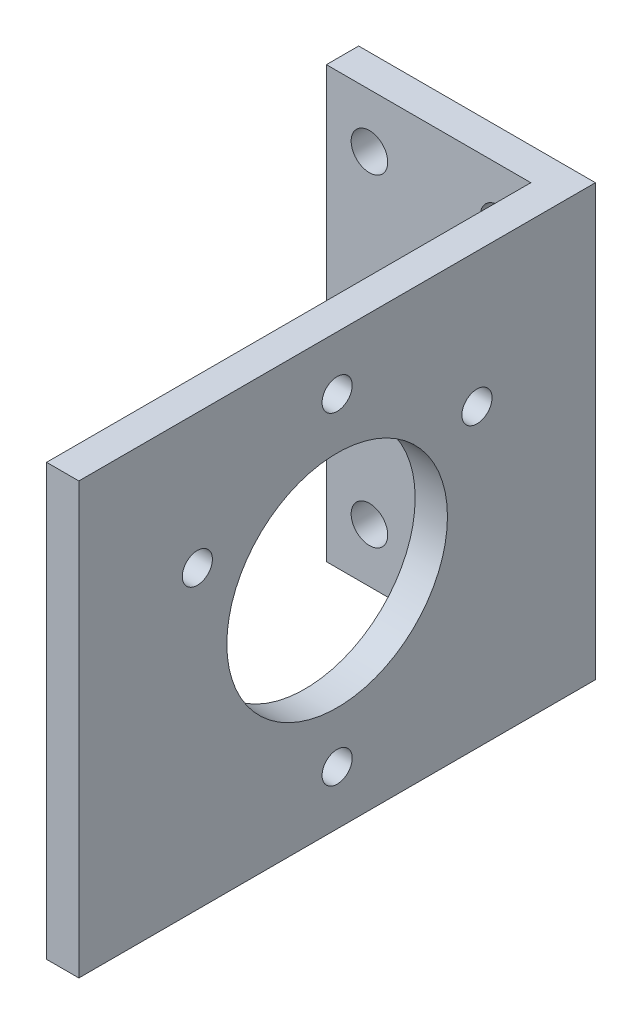
ISO-10303-21;
HEADER;
FILE_DESCRIPTION(('STEP AP214'),'2;1');
FILE_NAME('part.step','',(''),(''),'','','');
FILE_SCHEMA(('AUTOMOTIVE_DESIGN { 1 0 10303 214 1 1 1 1 }'));
ENDSEC;
DATA;
#1=APPLICATION_CONTEXT('core data for automotive mechanical design processes');
#2=APPLICATION_PROTOCOL_DEFINITION('international standard','automotive_design',2000,#1);
#3=PRODUCT_CONTEXT('',#1,'mechanical');
#4=PRODUCT('Part','Part','',(#3));
#5=PRODUCT_RELATED_PRODUCT_CATEGORY('part','',(#4));
#6=PRODUCT_DEFINITION_FORMATION('','',#4);
#7=PRODUCT_DEFINITION_CONTEXT('part definition',#1,'design');
#8=PRODUCT_DEFINITION('design','',#6,#7);
#9=PRODUCT_DEFINITION_SHAPE('','',#8);
#10=(LENGTH_UNIT() NAMED_UNIT(*) SI_UNIT(.MILLI.,.METRE.));
#11=(NAMED_UNIT(*) PLANE_ANGLE_UNIT() SI_UNIT($,.RADIAN.));
#12=(NAMED_UNIT(*) SI_UNIT($,.STERADIAN.) SOLID_ANGLE_UNIT());
#13=UNCERTAINTY_MEASURE_WITH_UNIT(LENGTH_MEASURE(1.E-05),#10,'distance_accuracy_value','');
#14=(GEOMETRIC_REPRESENTATION_CONTEXT(3) GLOBAL_UNCERTAINTY_ASSIGNED_CONTEXT((#13)) GLOBAL_UNIT_ASSIGNED_CONTEXT((#10,
#11,#12)) REPRESENTATION_CONTEXT('',''));
#15=CARTESIAN_POINT('',(0.,0.,0.));
#16=DIRECTION('',(0.,0.,1.));
#17=DIRECTION('',(1.,0.,0.));
#18=AXIS2_PLACEMENT_3D('',#15,#16,#17);
#19=CARTESIAN_POINT('',(118.,-20.,130.));
#20=DIRECTION('',(0.,1.,0.));
#21=DIRECTION('',(1.,0.,0.));
#22=AXIS2_PLACEMENT_3D('',#19,#20,#21);
#23=PLANE('',#22);
#24=DIRECTION('',(0.,0.,1.));
#25=VECTOR('',#24,1.);
#26=CARTESIAN_POINT('',(140.,-20.,130.));
#27=LINE('',#26,#25);
#28=CARTESIAN_POINT('',(140.,-20.,130.));
#29=VERTEX_POINT('',#28);
#30=CARTESIAN_POINT('',(140.,-20.,178.));
#31=VERTEX_POINT('',#30);
#32=EDGE_CURVE('E179',#29,#31,#27,.T.);
#33=ORIENTED_EDGE('',*,*,#32,.T.);
#34=DIRECTION('',(1.,0.,0.));
#35=VECTOR('',#34,1.);
#36=CARTESIAN_POINT('',(137.,-20.,178.));
#37=LINE('',#36,#35);
#38=CARTESIAN_POINT('',(137.,-20.,178.));
#39=VERTEX_POINT('',#38);
#40=EDGE_CURVE('E162',#39,#31,#37,.T.);
#41=ORIENTED_EDGE('',*,*,#40,.F.);
#42=DIRECTION('',(0.,0.,1.));
#43=VECTOR('',#42,1.);
#44=CARTESIAN_POINT('',(137.,-20.,130.));
#45=LINE('',#44,#43);
#46=CARTESIAN_POINT('',(137.,-20.,133.));
#47=VERTEX_POINT('',#46);
#48=EDGE_CURVE('E222',#47,#39,#45,.T.);
#49=ORIENTED_EDGE('',*,*,#48,.F.);
#50=DIRECTION('',(1.,0.,0.));
#51=VECTOR('',#50,1.);
#52=CARTESIAN_POINT('',(118.,-20.,133.));
#53=LINE('',#52,#51);
#54=CARTESIAN_POINT('',(118.,-20.,133.));
#55=VERTEX_POINT('',#54);
#56=EDGE_CURVE('E11',#55,#47,#53,.T.);
#57=ORIENTED_EDGE('',*,*,#56,.F.);
#58=DIRECTION('',(0.,0.,1.));
#59=VECTOR('',#58,1.);
#60=CARTESIAN_POINT('',(118.,-20.,130.));
#61=LINE('',#60,#59);
#62=CARTESIAN_POINT('',(118.,-20.,130.));
#63=VERTEX_POINT('',#62);
#64=EDGE_CURVE('E210',#63,#55,#61,.T.);
#65=ORIENTED_EDGE('',*,*,#64,.F.);
#66=DIRECTION('',(1.,0.,0.));
#67=VECTOR('',#66,1.);
#68=CARTESIAN_POINT('',(118.,-20.,130.));
#69=LINE('',#68,#67);
#70=EDGE_CURVE('E186',#63,#29,#69,.T.);
#71=ORIENTED_EDGE('',*,*,#70,.T.);
#72=EDGE_LOOP('',(#33,#41,#49,#57,#65,#71));
#73=FACE_BOUND('',#72,.T.);
#74=ADVANCED_FACE('F17',(#73),#23,.F.);
#75=CARTESIAN_POINT('',(118.,-20.,133.));
#76=DIRECTION('',(0.,0.,1.));
#77=DIRECTION('',(1.,0.,0.));
#78=AXIS2_PLACEMENT_3D('',#75,#76,#77);
#79=PLANE('',#78);
#80=CARTESIAN_POINT('',(134.,15.,133.));
#81=DIRECTION('',(0.,0.,1.));
#82=DIRECTION('',(1.,0.,0.));
#83=AXIS2_PLACEMENT_3D('',#80,#81,#82);
#84=CIRCLE('',#83,1.7);
#85=CARTESIAN_POINT('',(135.7,15.,133.));
#86=VERTEX_POINT('',#85);
#87=EDGE_CURVE('E236',#86,#86,#84,.T.);
#88=ORIENTED_EDGE('',*,*,#87,.F.);
#89=EDGE_LOOP('',(#88));
#90=FACE_BOUND('',#89,.T.);
#91=CARTESIAN_POINT('',(122.,15.,133.));
#92=DIRECTION('',(0.,0.,1.));
#93=DIRECTION('',(1.,0.,0.));
#94=AXIS2_PLACEMENT_3D('',#91,#92,#93);
#95=CIRCLE('',#94,1.7);
#96=CARTESIAN_POINT('',(123.7,15.,133.));
#97=VERTEX_POINT('',#96);
#98=EDGE_CURVE('E254',#97,#97,#95,.T.);
#99=ORIENTED_EDGE('',*,*,#98,.F.);
#100=EDGE_LOOP('',(#99));
#101=FACE_BOUND('',#100,.T.);
#102=CARTESIAN_POINT('',(134.,-15.,133.));
#103=DIRECTION('',(0.,0.,1.));
#104=DIRECTION('',(1.,0.,0.));
#105=AXIS2_PLACEMENT_3D('',#102,#103,#104);
#106=CIRCLE('',#105,1.7);
#107=CARTESIAN_POINT('',(135.7,-15.,133.));
#108=VERTEX_POINT('',#107);
#109=EDGE_CURVE('E270',#108,#108,#106,.T.);
#110=ORIENTED_EDGE('',*,*,#109,.F.);
#111=EDGE_LOOP('',(#110));
#112=FACE_BOUND('',#111,.T.);
#113=CARTESIAN_POINT('',(122.,-15.,133.));
#114=DIRECTION('',(0.,0.,1.));
#115=DIRECTION('',(1.,0.,0.));
#116=AXIS2_PLACEMENT_3D('',#113,#114,#115);
#117=CIRCLE('',#116,1.7);
#118=CARTESIAN_POINT('',(123.7,-15.,133.));
#119=VERTEX_POINT('',#118);
#120=EDGE_CURVE('E189',#119,#119,#117,.T.);
#121=ORIENTED_EDGE('',*,*,#120,.F.);
#122=EDGE_LOOP('',(#121));
#123=FACE_BOUND('',#122,.T.);
#124=DIRECTION('',(1.,0.,0.));
#125=VECTOR('',#124,1.);
#126=CARTESIAN_POINT('',(118.,20.,133.));
#127=LINE('',#126,#125);
#128=CARTESIAN_POINT('',(118.,20.,133.));
#129=VERTEX_POINT('',#128);
#130=CARTESIAN_POINT('',(137.,20.,133.));
#131=VERTEX_POINT('',#130);
#132=EDGE_CURVE('E26',#129,#131,#127,.T.);
#133=ORIENTED_EDGE('',*,*,#132,.F.);
#134=DIRECTION('',(0.,1.,0.));
#135=VECTOR('',#134,1.);
#136=CARTESIAN_POINT('',(118.,-20.,133.));
#137=LINE('',#136,#135);
#138=EDGE_CURVE('E199',#55,#129,#137,.T.);
#139=ORIENTED_EDGE('',*,*,#138,.F.);
#140=ORIENTED_EDGE('',*,*,#56,.T.);
#141=DIRECTION('',(0.,1.,0.));
#142=VECTOR('',#141,1.);
#143=CARTESIAN_POINT('',(137.,-20.,133.));
#144=LINE('',#143,#142);
#145=EDGE_CURVE('E301',#47,#131,#144,.T.);
#146=ORIENTED_EDGE('',*,*,#145,.T.);
#147=EDGE_LOOP('',(#133,#139,#140,#146));
#148=FACE_BOUND('',#147,.T.);
#149=ADVANCED_FACE('F19',(#90,#101,#112,#123,#148),#79,.T.);
#150=CARTESIAN_POINT('',(118.,20.,130.));
#151=DIRECTION('',(0.,1.,0.));
#152=DIRECTION('',(1.,0.,0.));
#153=AXIS2_PLACEMENT_3D('',#150,#151,#152);
#154=PLANE('',#153);
#155=DIRECTION('',(0.,0.,1.));
#156=VECTOR('',#155,1.);
#157=CARTESIAN_POINT('',(118.,20.,130.));
#158=LINE('',#157,#156);
#159=CARTESIAN_POINT('',(118.,20.,130.));
#160=VERTEX_POINT('',#159);
#161=EDGE_CURVE('E202',#160,#129,#158,.T.);
#162=ORIENTED_EDGE('',*,*,#161,.T.);
#163=ORIENTED_EDGE('',*,*,#132,.T.);
#164=DIRECTION('',(0.,0.,1.));
#165=VECTOR('',#164,1.);
#166=CARTESIAN_POINT('',(137.,20.,130.));
#167=LINE('',#166,#165);
#168=CARTESIAN_POINT('',(137.,20.,178.));
#169=VERTEX_POINT('',#168);
#170=EDGE_CURVE('E297',#131,#169,#167,.T.);
#171=ORIENTED_EDGE('',*,*,#170,.T.);
#172=DIRECTION('',(1.,0.,0.));
#173=VECTOR('',#172,1.);
#174=CARTESIAN_POINT('',(137.,20.,178.));
#175=LINE('',#174,#173);
#176=CARTESIAN_POINT('',(140.,20.,178.));
#177=VERTEX_POINT('',#176);
#178=EDGE_CURVE('E174',#169,#177,#175,.T.);
#179=ORIENTED_EDGE('',*,*,#178,.T.);
#180=DIRECTION('',(0.,0.,-1.));
#181=VECTOR('',#180,1.);
#182=CARTESIAN_POINT('',(140.,20.,178.));
#183=LINE('',#182,#181);
#184=CARTESIAN_POINT('',(140.,20.,130.));
#185=VERTEX_POINT('',#184);
#186=EDGE_CURVE('E181',#177,#185,#183,.T.);
#187=ORIENTED_EDGE('',*,*,#186,.T.);
#188=DIRECTION('',(-1.,0.,0.));
#189=VECTOR('',#188,1.);
#190=CARTESIAN_POINT('',(140.,20.,130.));
#191=LINE('',#190,#189);
#192=EDGE_CURVE('E226',#185,#160,#191,.T.);
#193=ORIENTED_EDGE('',*,*,#192,.T.);
#194=EDGE_LOOP('',(#162,#163,#171,#179,#187,#193));
#195=FACE_BOUND('',#194,.T.);
#196=ADVANCED_FACE('F326',(#195),#154,.T.);
#197=CARTESIAN_POINT('',(137.,-20.,178.));
#198=DIRECTION('',(0.,0.,1.));
#199=DIRECTION('',(1.,0.,0.));
#200=AXIS2_PLACEMENT_3D('',#197,#198,#199);
#201=PLANE('',#200);
#202=DIRECTION('',(0.,1.,0.));
#203=VECTOR('',#202,1.);
#204=CARTESIAN_POINT('',(137.,-20.,178.));
#205=LINE('',#204,#203);
#206=EDGE_CURVE('E168',#39,#169,#205,.T.);
#207=ORIENTED_EDGE('',*,*,#206,.F.);
#208=ORIENTED_EDGE('',*,*,#40,.T.);
#209=DIRECTION('',(0.,1.,0.));
#210=VECTOR('',#209,1.);
#211=CARTESIAN_POINT('',(140.,-20.,178.));
#212=LINE('',#211,#210);
#213=EDGE_CURVE('E165',#31,#177,#212,.T.);
#214=ORIENTED_EDGE('',*,*,#213,.T.);
#215=ORIENTED_EDGE('',*,*,#178,.F.);
#216=EDGE_LOOP('',(#207,#208,#214,#215));
#217=FACE_BOUND('',#216,.T.);
#218=ADVANCED_FACE('F164',(#217),#201,.T.);
#219=CARTESIAN_POINT('',(136.,-15.,154.));
#220=DIRECTION('',(1.,0.,0.));
#221=DIRECTION('',(0.,0.,1.));
#222=AXIS2_PLACEMENT_3D('',#219,#220,#221);
#223=CYLINDRICAL_SURFACE('',#222,1.4);
#224=DIRECTION('',(1.,0.,0.));
#225=VECTOR('',#224,1.);
#226=CARTESIAN_POINT('',(136.,-15.,155.4));
#227=LINE('',#226,#225);
#228=CARTESIAN_POINT('',(137.,-15.,155.4));
#229=VERTEX_POINT('',#228);
#230=CARTESIAN_POINT('',(140.,-15.,155.4));
#231=VERTEX_POINT('',#230);
#232=EDGE_CURVE('E38',#229,#231,#227,.T.);
#233=ORIENTED_EDGE('',*,*,#232,.F.);
#234=CARTESIAN_POINT('',(137.,-15.,154.));
#235=DIRECTION('',(1.,0.,0.));
#236=DIRECTION('',(0.,0.,1.));
#237=AXIS2_PLACEMENT_3D('',#234,#235,#236);
#238=CIRCLE('',#237,1.4);
#239=EDGE_CURVE('E230',#229,#229,#238,.T.);
#240=ORIENTED_EDGE('',*,*,#239,.F.);
#241=ORIENTED_EDGE('',*,*,#232,.T.);
#242=CARTESIAN_POINT('',(140.,-15.,154.));
#243=DIRECTION('',(1.,0.,0.));
#244=DIRECTION('',(0.,0.,1.));
#245=AXIS2_PLACEMENT_3D('',#242,#243,#244);
#246=CIRCLE('',#245,1.4);
#247=EDGE_CURVE('E183',#231,#231,#246,.T.);
#248=ORIENTED_EDGE('',*,*,#247,.T.);
#249=EDGE_LOOP('',(#233,#240,#241,#248));
#250=FACE_BOUND('',#249,.T.);
#251=ADVANCED_FACE('F366',(#250),#223,.F.);
#252=CARTESIAN_POINT('',(136.,7.5,141.0096));
#253=DIRECTION('',(1.,0.,0.));
#254=DIRECTION('',(0.,0.,1.));
#255=AXIS2_PLACEMENT_3D('',#252,#253,#254);
#256=CYLINDRICAL_SURFACE('',#255,1.4);
#257=DIRECTION('',(1.,0.,0.));
#258=VECTOR('',#257,1.);
#259=CARTESIAN_POINT('',(136.,7.5,142.4096));
#260=LINE('',#259,#258);
#261=CARTESIAN_POINT('',(137.,7.5,142.4096));
#262=VERTEX_POINT('',#261);
#263=CARTESIAN_POINT('',(140.,7.5,142.4096));
#264=VERTEX_POINT('',#263);
#265=EDGE_CURVE('E317',#262,#264,#260,.T.);
#266=ORIENTED_EDGE('',*,*,#265,.F.);
#267=CARTESIAN_POINT('',(137.,7.5,141.0096));
#268=DIRECTION('',(1.,0.,0.));
#269=DIRECTION('',(0.,0.,1.));
#270=AXIS2_PLACEMENT_3D('',#267,#268,#269);
#271=CIRCLE('',#270,1.4);
#272=EDGE_CURVE('E217',#262,#262,#271,.T.);
#273=ORIENTED_EDGE('',*,*,#272,.F.);
#274=ORIENTED_EDGE('',*,*,#265,.T.);
#275=CARTESIAN_POINT('',(140.,7.5,141.0096));
#276=DIRECTION('',(1.,0.,0.));
#277=DIRECTION('',(0.,0.,1.));
#278=AXIS2_PLACEMENT_3D('',#275,#276,#277);
#279=CIRCLE('',#278,1.4);
#280=EDGE_CURVE('E278',#264,#264,#279,.T.);
#281=ORIENTED_EDGE('',*,*,#280,.T.);
#282=EDGE_LOOP('',(#266,#273,#274,#281));
#283=FACE_BOUND('',#282,.T.);
#284=ADVANCED_FACE('F363',(#283),#256,.F.);
#285=CARTESIAN_POINT('',(136.,15.,154.));
#286=DIRECTION('',(1.,0.,0.));
#287=DIRECTION('',(0.,0.,1.));
#288=AXIS2_PLACEMENT_3D('',#285,#286,#287);
#289=CYLINDRICAL_SURFACE('',#288,1.4);
#290=DIRECTION('',(1.,0.,0.));
#291=VECTOR('',#290,1.);
#292=CARTESIAN_POINT('',(136.,15.,155.4));
#293=LINE('',#292,#291);
#294=CARTESIAN_POINT('',(137.,15.,155.4));
#295=VERTEX_POINT('',#294);
#296=CARTESIAN_POINT('',(140.,15.,155.4));
#297=VERTEX_POINT('',#296);
#298=EDGE_CURVE('E229',#295,#297,#293,.T.);
#299=ORIENTED_EDGE('',*,*,#298,.F.);
#300=CARTESIAN_POINT('',(137.,15.,154.));
#301=DIRECTION('',(1.,0.,0.));
#302=DIRECTION('',(0.,0.,1.));
#303=AXIS2_PLACEMENT_3D('',#300,#301,#302);
#304=CIRCLE('',#303,1.4);
#305=EDGE_CURVE('E221',#295,#295,#304,.T.);
#306=ORIENTED_EDGE('',*,*,#305,.F.);
#307=ORIENTED_EDGE('',*,*,#298,.T.);
#308=CARTESIAN_POINT('',(140.,15.,154.));
#309=DIRECTION('',(1.,0.,0.));
#310=DIRECTION('',(0.,0.,1.));
#311=AXIS2_PLACEMENT_3D('',#308,#309,#310);
#312=CIRCLE('',#311,1.4);
#313=EDGE_CURVE('E282',#297,#297,#312,.T.);
#314=ORIENTED_EDGE('',*,*,#313,.T.);
#315=EDGE_LOOP('',(#299,#306,#307,#314));
#316=FACE_BOUND('',#315,.T.);
#317=ADVANCED_FACE('F365',(#316),#289,.F.);
#318=CARTESIAN_POINT('',(136.,7.5,166.9904));
#319=DIRECTION('',(1.,0.,0.));
#320=DIRECTION('',(0.,0.,1.));
#321=AXIS2_PLACEMENT_3D('',#318,#319,#320);
#322=CYLINDRICAL_SURFACE('',#321,1.4);
#323=DIRECTION('',(1.,0.,0.));
#324=VECTOR('',#323,1.);
#325=CARTESIAN_POINT('',(136.,7.5,168.3904));
#326=LINE('',#325,#324);
#327=CARTESIAN_POINT('',(137.,7.5,168.3904));
#328=VERTEX_POINT('',#327);
#329=CARTESIAN_POINT('',(140.,7.5,168.3904));
#330=VERTEX_POINT('',#329);
#331=EDGE_CURVE('E48',#328,#330,#326,.T.);
#332=ORIENTED_EDGE('',*,*,#331,.F.);
#333=CARTESIAN_POINT('',(137.,7.5,166.9904));
#334=DIRECTION('',(1.,0.,0.));
#335=DIRECTION('',(0.,0.,1.));
#336=AXIS2_PLACEMENT_3D('',#333,#334,#335);
#337=CIRCLE('',#336,1.4);
#338=EDGE_CURVE('E310',#328,#328,#337,.T.);
#339=ORIENTED_EDGE('',*,*,#338,.F.);
#340=ORIENTED_EDGE('',*,*,#331,.T.);
#341=CARTESIAN_POINT('',(140.,7.5,166.9904));
#342=DIRECTION('',(1.,0.,0.));
#343=DIRECTION('',(0.,0.,1.));
#344=AXIS2_PLACEMENT_3D('',#341,#342,#343);
#345=CIRCLE('',#344,1.4);
#346=EDGE_CURVE('E286',#330,#330,#345,.T.);
#347=ORIENTED_EDGE('',*,*,#346,.T.);
#348=EDGE_LOOP('',(#332,#339,#340,#347));
#349=FACE_BOUND('',#348,.T.);
#350=ADVANCED_FACE('F372',(#349),#322,.F.);
#351=CARTESIAN_POINT('',(137.,-20.,130.));
#352=DIRECTION('',(1.,0.,0.));
#353=DIRECTION('',(0.,1.,0.));
#354=AXIS2_PLACEMENT_3D('',#351,#352,#353);
#355=PLANE('',#354);
#356=ORIENTED_EDGE('',*,*,#239,.T.);
#357=EDGE_LOOP('',(#356));
#358=FACE_BOUND('',#357,.T.);
#359=CARTESIAN_POINT('',(137.,0.,154.));
#360=DIRECTION('',(1.,0.,0.));
#361=DIRECTION('',(0.,0.,1.));
#362=AXIS2_PLACEMENT_3D('',#359,#360,#361);
#363=CIRCLE('',#362,10.25);
#364=CARTESIAN_POINT('',(137.,0.,164.25));
#365=VERTEX_POINT('',#364);
#366=EDGE_CURVE('E247',#365,#365,#363,.T.);
#367=ORIENTED_EDGE('',*,*,#366,.T.);
#368=EDGE_LOOP('',(#367));
#369=FACE_BOUND('',#368,.T.);
#370=ORIENTED_EDGE('',*,*,#338,.T.);
#371=EDGE_LOOP('',(#370));
#372=FACE_BOUND('',#371,.T.);
#373=ORIENTED_EDGE('',*,*,#305,.T.);
#374=EDGE_LOOP('',(#373));
#375=FACE_BOUND('',#374,.T.);
#376=ORIENTED_EDGE('',*,*,#272,.T.);
#377=EDGE_LOOP('',(#376));
#378=FACE_BOUND('',#377,.T.);
#379=ORIENTED_EDGE('',*,*,#206,.T.);
#380=ORIENTED_EDGE('',*,*,#170,.F.);
#381=ORIENTED_EDGE('',*,*,#145,.F.);
#382=ORIENTED_EDGE('',*,*,#48,.T.);
#383=EDGE_LOOP('',(#379,#380,#381,#382));
#384=FACE_BOUND('',#383,.T.);
#385=ADVANCED_FACE('F333',(#358,#369,#372,#375,#378,#384),#355,.F.);
#386=CARTESIAN_POINT('',(136.,0.,154.));
#387=DIRECTION('',(1.,0.,0.));
#388=DIRECTION('',(0.,0.,1.));
#389=AXIS2_PLACEMENT_3D('',#386,#387,#388);
#390=CYLINDRICAL_SURFACE('',#389,10.25);
#391=DIRECTION('',(1.,0.,0.));
#392=VECTOR('',#391,1.);
#393=CARTESIAN_POINT('',(136.,0.,164.25));
#394=LINE('',#393,#392);
#395=CARTESIAN_POINT('',(140.,0.,164.25));
#396=VERTEX_POINT('',#395);
#397=EDGE_CURVE('E250',#365,#396,#394,.T.);
#398=ORIENTED_EDGE('',*,*,#397,.F.);
#399=ORIENTED_EDGE('',*,*,#366,.F.);
#400=ORIENTED_EDGE('',*,*,#397,.T.);
#401=CARTESIAN_POINT('',(140.,0.,154.));
#402=DIRECTION('',(1.,0.,0.));
#403=DIRECTION('',(0.,0.,1.));
#404=AXIS2_PLACEMENT_3D('',#401,#402,#403);
#405=CIRCLE('',#404,10.25);
#406=EDGE_CURVE('E289',#396,#396,#405,.T.);
#407=ORIENTED_EDGE('',*,*,#406,.T.);
#408=EDGE_LOOP('',(#398,#399,#400,#407));
#409=FACE_BOUND('',#408,.T.);
#410=ADVANCED_FACE('F379',(#409),#390,.F.);
#411=CARTESIAN_POINT('',(140.,-20.,130.));
#412=DIRECTION('',(1.,0.,0.));
#413=DIRECTION('',(0.,1.,0.));
#414=AXIS2_PLACEMENT_3D('',#411,#412,#413);
#415=PLANE('',#414);
#416=ORIENTED_EDGE('',*,*,#406,.F.);
#417=EDGE_LOOP('',(#416));
#418=FACE_BOUND('',#417,.T.);
#419=ORIENTED_EDGE('',*,*,#346,.F.);
#420=EDGE_LOOP('',(#419));
#421=FACE_BOUND('',#420,.T.);
#422=ORIENTED_EDGE('',*,*,#313,.F.);
#423=EDGE_LOOP('',(#422));
#424=FACE_BOUND('',#423,.T.);
#425=ORIENTED_EDGE('',*,*,#280,.F.);
#426=EDGE_LOOP('',(#425));
#427=FACE_BOUND('',#426,.T.);
#428=ORIENTED_EDGE('',*,*,#247,.F.);
#429=EDGE_LOOP('',(#428));
#430=FACE_BOUND('',#429,.T.);
#431=ORIENTED_EDGE('',*,*,#32,.F.);
#432=DIRECTION('',(0.,1.,0.));
#433=VECTOR('',#432,1.);
#434=CARTESIAN_POINT('',(140.,-20.,130.));
#435=LINE('',#434,#433);
#436=EDGE_CURVE('E233',#29,#185,#435,.T.);
#437=ORIENTED_EDGE('',*,*,#436,.T.);
#438=ORIENTED_EDGE('',*,*,#186,.F.);
#439=ORIENTED_EDGE('',*,*,#213,.F.);
#440=EDGE_LOOP('',(#431,#437,#438,#439));
#441=FACE_BOUND('',#440,.T.);
#442=ADVANCED_FACE('F177',(#418,#421,#424,#427,#430,#441),#415,.T.);
#443=CARTESIAN_POINT('',(122.,-15.,129.));
#444=DIRECTION('',(0.,0.,1.));
#445=DIRECTION('',(1.,0.,0.));
#446=AXIS2_PLACEMENT_3D('',#443,#444,#445);
#447=CYLINDRICAL_SURFACE('',#446,1.7);
#448=DIRECTION('',(0.,0.,1.));
#449=VECTOR('',#448,1.);
#450=CARTESIAN_POINT('',(123.7,-15.,129.));
#451=LINE('',#450,#449);
#452=CARTESIAN_POINT('',(123.7,-15.,130.));
#453=VERTEX_POINT('',#452);
#454=EDGE_CURVE('E196',#453,#119,#451,.T.);
#455=ORIENTED_EDGE('',*,*,#454,.F.);
#456=CARTESIAN_POINT('',(122.,-15.,130.));
#457=DIRECTION('',(0.,0.,1.));
#458=DIRECTION('',(1.,0.,0.));
#459=AXIS2_PLACEMENT_3D('',#456,#457,#458);
#460=CIRCLE('',#459,1.7);
#461=EDGE_CURVE('E241',#453,#453,#460,.T.);
#462=ORIENTED_EDGE('',*,*,#461,.F.);
#463=ORIENTED_EDGE('',*,*,#454,.T.);
#464=ORIENTED_EDGE('',*,*,#120,.T.);
#465=EDGE_LOOP('',(#455,#462,#463,#464));
#466=FACE_BOUND('',#465,.T.);
#467=ADVANCED_FACE('F396',(#466),#447,.F.);
#468=CARTESIAN_POINT('',(134.,-15.,129.));
#469=DIRECTION('',(0.,0.,1.));
#470=DIRECTION('',(1.,0.,0.));
#471=AXIS2_PLACEMENT_3D('',#468,#469,#470);
#472=CYLINDRICAL_SURFACE('',#471,1.7);
#473=DIRECTION('',(0.,0.,1.));
#474=VECTOR('',#473,1.);
#475=CARTESIAN_POINT('',(135.7,-15.,129.));
#476=LINE('',#475,#474);
#477=CARTESIAN_POINT('',(135.7,-15.,130.));
#478=VERTEX_POINT('',#477);
#479=EDGE_CURVE('E265',#478,#108,#476,.T.);
#480=ORIENTED_EDGE('',*,*,#479,.F.);
#481=CARTESIAN_POINT('',(134.,-15.,130.));
#482=DIRECTION('',(0.,0.,1.));
#483=DIRECTION('',(1.,0.,0.));
#484=AXIS2_PLACEMENT_3D('',#481,#482,#483);
#485=CIRCLE('',#484,1.7);
#486=EDGE_CURVE('E216',#478,#478,#485,.T.);
#487=ORIENTED_EDGE('',*,*,#486,.F.);
#488=ORIENTED_EDGE('',*,*,#479,.T.);
#489=ORIENTED_EDGE('',*,*,#109,.T.);
#490=EDGE_LOOP('',(#480,#487,#488,#489));
#491=FACE_BOUND('',#490,.T.);
#492=ADVANCED_FACE('F404',(#491),#472,.F.);
#493=CARTESIAN_POINT('',(122.,15.,129.));
#494=DIRECTION('',(0.,0.,1.));
#495=DIRECTION('',(1.,0.,0.));
#496=AXIS2_PLACEMENT_3D('',#493,#494,#495);
#497=CYLINDRICAL_SURFACE('',#496,1.7);
#498=DIRECTION('',(0.,0.,1.));
#499=VECTOR('',#498,1.);
#500=CARTESIAN_POINT('',(123.7,15.,129.));
#501=LINE('',#500,#499);
#502=CARTESIAN_POINT('',(123.7,15.,130.));
#503=VERTEX_POINT('',#502);
#504=EDGE_CURVE('E239',#503,#97,#501,.T.);
#505=ORIENTED_EDGE('',*,*,#504,.F.);
#506=CARTESIAN_POINT('',(122.,15.,130.));
#507=DIRECTION('',(0.,0.,1.));
#508=DIRECTION('',(1.,0.,0.));
#509=AXIS2_PLACEMENT_3D('',#506,#507,#508);
#510=CIRCLE('',#509,1.7);
#511=EDGE_CURVE('E211',#503,#503,#510,.T.);
#512=ORIENTED_EDGE('',*,*,#511,.F.);
#513=ORIENTED_EDGE('',*,*,#504,.T.);
#514=ORIENTED_EDGE('',*,*,#98,.T.);
#515=EDGE_LOOP('',(#505,#512,#513,#514));
#516=FACE_BOUND('',#515,.T.);
#517=ADVANCED_FACE('F350',(#516),#497,.F.);
#518=CARTESIAN_POINT('',(134.,15.,129.));
#519=DIRECTION('',(0.,0.,1.));
#520=DIRECTION('',(1.,0.,0.));
#521=AXIS2_PLACEMENT_3D('',#518,#519,#520);
#522=CYLINDRICAL_SURFACE('',#521,1.7);
#523=DIRECTION('',(0.,0.,1.));
#524=VECTOR('',#523,1.);
#525=CARTESIAN_POINT('',(135.7,15.,129.));
#526=LINE('',#525,#524);
#527=CARTESIAN_POINT('',(135.7,15.,130.));
#528=VERTEX_POINT('',#527);
#529=EDGE_CURVE('E240',#528,#86,#526,.T.);
#530=ORIENTED_EDGE('',*,*,#529,.F.);
#531=CARTESIAN_POINT('',(134.,15.,130.));
#532=DIRECTION('',(0.,0.,1.));
#533=DIRECTION('',(1.,0.,0.));
#534=AXIS2_PLACEMENT_3D('',#531,#532,#533);
#535=CIRCLE('',#534,1.7);
#536=EDGE_CURVE('E215',#528,#528,#535,.T.);
#537=ORIENTED_EDGE('',*,*,#536,.F.);
#538=ORIENTED_EDGE('',*,*,#529,.T.);
#539=ORIENTED_EDGE('',*,*,#87,.T.);
#540=EDGE_LOOP('',(#530,#537,#538,#539));
#541=FACE_BOUND('',#540,.T.);
#542=ADVANCED_FACE('F341',(#541),#522,.F.);
#543=CARTESIAN_POINT('',(118.,-20.,130.));
#544=DIRECTION('',(0.,0.,1.));
#545=DIRECTION('',(1.,0.,0.));
#546=AXIS2_PLACEMENT_3D('',#543,#544,#545);
#547=PLANE('',#546);
#548=ORIENTED_EDGE('',*,*,#536,.T.);
#549=EDGE_LOOP('',(#548));
#550=FACE_BOUND('',#549,.T.);
#551=ORIENTED_EDGE('',*,*,#511,.T.);
#552=EDGE_LOOP('',(#551));
#553=FACE_BOUND('',#552,.T.);
#554=ORIENTED_EDGE('',*,*,#486,.T.);
#555=EDGE_LOOP('',(#554));
#556=FACE_BOUND('',#555,.T.);
#557=ORIENTED_EDGE('',*,*,#461,.T.);
#558=EDGE_LOOP('',(#557));
#559=FACE_BOUND('',#558,.T.);
#560=ORIENTED_EDGE('',*,*,#192,.F.);
#561=ORIENTED_EDGE('',*,*,#436,.F.);
#562=ORIENTED_EDGE('',*,*,#70,.F.);
#563=DIRECTION('',(0.,1.,0.));
#564=VECTOR('',#563,1.);
#565=CARTESIAN_POINT('',(118.,-20.,130.));
#566=LINE('',#565,#564);
#567=EDGE_CURVE('E206',#63,#160,#566,.T.);
#568=ORIENTED_EDGE('',*,*,#567,.T.);
#569=EDGE_LOOP('',(#560,#561,#562,#568));
#570=FACE_BOUND('',#569,.T.);
#571=ADVANCED_FACE('F339',(#550,#553,#556,#559,#570),#547,.F.);
#572=CARTESIAN_POINT('',(118.,-20.,130.));
#573=DIRECTION('',(1.,0.,0.));
#574=DIRECTION('',(0.,1.,0.));
#575=AXIS2_PLACEMENT_3D('',#572,#573,#574);
#576=PLANE('',#575);
#577=ORIENTED_EDGE('',*,*,#138,.T.);
#578=ORIENTED_EDGE('',*,*,#161,.F.);
#579=ORIENTED_EDGE('',*,*,#567,.F.);
#580=ORIENTED_EDGE('',*,*,#64,.T.);
#581=EDGE_LOOP('',(#577,#578,#579,#580));
#582=FACE_BOUND('',#581,.T.);
#583=ADVANCED_FACE('F336',(#582),#576,.F.);
#584=CLOSED_SHELL('',(#74,#149,#196,#218,#251,#284,#317,#350,#385,#410,#442,#467,#492,#517,#542,
#571,#583));
#585=MANIFOLD_SOLID_BREP('B1',#584);
#586=ADVANCED_BREP_SHAPE_REPRESENTATION('',(#18,#585),#14);
#587=SHAPE_DEFINITION_REPRESENTATION(#9,#586);
ENDSEC;
END-ISO-10303-21;
